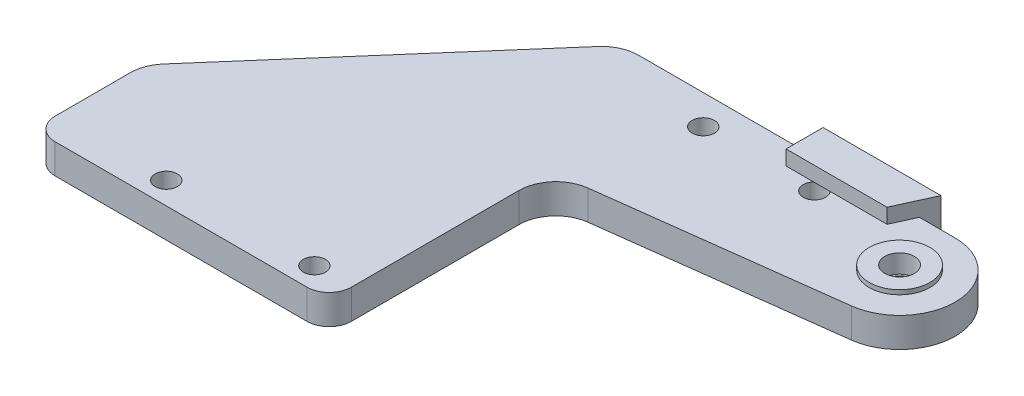
ISO-10303-21;
HEADER;
FILE_DESCRIPTION(('STEP AP214'),'2;1');
FILE_NAME('part.step','',(''),(''),'','','');
FILE_SCHEMA(('AUTOMOTIVE_DESIGN { 1 0 10303 214 1 1 1 1 }'));
ENDSEC;
DATA;
#1=APPLICATION_CONTEXT('core data for automotive mechanical design processes');
#2=APPLICATION_PROTOCOL_DEFINITION('international standard','automotive_design',2000,#1);
#3=PRODUCT_CONTEXT('',#1,'mechanical');
#4=PRODUCT('Part','Part','',(#3));
#5=PRODUCT_RELATED_PRODUCT_CATEGORY('part','',(#4));
#6=PRODUCT_DEFINITION_FORMATION('','',#4);
#7=PRODUCT_DEFINITION_CONTEXT('part definition',#1,'design');
#8=PRODUCT_DEFINITION('design','',#6,#7);
#9=PRODUCT_DEFINITION_SHAPE('','',#8);
#10=(LENGTH_UNIT() NAMED_UNIT(*) SI_UNIT(.MILLI.,.METRE.));
#11=(NAMED_UNIT(*) PLANE_ANGLE_UNIT() SI_UNIT($,.RADIAN.));
#12=(NAMED_UNIT(*) SI_UNIT($,.STERADIAN.) SOLID_ANGLE_UNIT());
#13=UNCERTAINTY_MEASURE_WITH_UNIT(LENGTH_MEASURE(1.E-05),#10,'distance_accuracy_value','');
#14=(GEOMETRIC_REPRESENTATION_CONTEXT(3) GLOBAL_UNCERTAINTY_ASSIGNED_CONTEXT((#13)) GLOBAL_UNIT_ASSIGNED_CONTEXT((#10,
#11,#12)) REPRESENTATION_CONTEXT('',''));
#15=CARTESIAN_POINT('',(0.,0.,0.));
#16=DIRECTION('',(0.,0.,1.));
#17=DIRECTION('',(1.,0.,0.));
#18=AXIS2_PLACEMENT_3D('',#15,#16,#17);
#19=CARTESIAN_POINT('',(68.8086591282946,6.,-46.5));
#20=DIRECTION('',(0.,0.,-1.));
#21=DIRECTION('',(-1.,0.,0.));
#22=AXIS2_PLACEMENT_3D('',#19,#20,#21);
#23=PLANE('',#22);
#24=DIRECTION('',(1.,0.,0.));
#25=VECTOR('',#24,1.);
#26=CARTESIAN_POINT('',(68.8086591282946,4.,-46.5));
#27=LINE('',#26,#25);
#28=CARTESIAN_POINT('',(55.1758378948923,4.,-46.5));
#29=VERTEX_POINT('',#28);
#30=CARTESIAN_POINT('',(68.8086591282946,4.,-46.5));
#31=VERTEX_POINT('',#30);
#32=EDGE_CURVE('E155',#29,#31,#27,.T.);
#33=ORIENTED_EDGE('',*,*,#32,.T.);
#34=DIRECTION('',(0.,-1.,0.));
#35=VECTOR('',#34,1.);
#36=CARTESIAN_POINT('',(68.8086591282946,6.,-46.5));
#37=LINE('',#36,#35);
#38=CARTESIAN_POINT('',(68.8086591282946,6.,-46.5));
#39=VERTEX_POINT('',#38);
#40=EDGE_CURVE('E12',#39,#31,#37,.T.);
#41=ORIENTED_EDGE('',*,*,#40,.F.);
#42=DIRECTION('',(1.,0.,0.));
#43=VECTOR('',#42,1.);
#44=CARTESIAN_POINT('',(68.8086591282946,6.,-46.5));
#45=LINE('',#44,#43);
#46=CARTESIAN_POINT('',(55.1758378948923,6.,-46.5));
#47=VERTEX_POINT('',#46);
#48=EDGE_CURVE('E161',#47,#39,#45,.T.);
#49=ORIENTED_EDGE('',*,*,#48,.F.);
#50=DIRECTION('',(0.,-1.,0.));
#51=VECTOR('',#50,1.);
#52=CARTESIAN_POINT('',(55.1758378948923,6.,-46.5));
#53=LINE('',#52,#51);
#54=EDGE_CURVE('E167',#47,#29,#53,.T.);
#55=ORIENTED_EDGE('',*,*,#54,.T.);
#56=EDGE_LOOP('',(#33,#41,#49,#55));
#57=FACE_BOUND('',#56,.T.);
#58=ADVANCED_FACE('F52',(#57),#23,.F.);
#59=CARTESIAN_POINT('',(71.0872904059575,6.,-51.5));
#60=DIRECTION('',(-0.909961270876545,0.,-0.414693242656235));
#61=DIRECTION('',(-0.414693242656235,0.,0.909961270876545));
#62=AXIS2_PLACEMENT_3D('',#59,#60,#61);
#63=PLANE('',#62);
#64=DIRECTION('',(0.414693242656235,0.,-0.909961270876545));
#65=VECTOR('',#64,1.);
#66=CARTESIAN_POINT('',(71.0872904059575,4.,-51.5));
#67=LINE('',#66,#65);
#68=CARTESIAN_POINT('',(70.1758378948923,4.,-49.5));
#69=VERTEX_POINT('',#68);
#70=EDGE_CURVE('E170',#31,#69,#67,.T.);
#71=ORIENTED_EDGE('',*,*,#70,.T.);
#72=DIRECTION('',(0.,-1.,0.));
#73=VECTOR('',#72,1.);
#74=CARTESIAN_POINT('',(70.1758378948923,20.0366555432198,-49.5));
#75=LINE('',#74,#73);
#76=CARTESIAN_POINT('',(70.1758378948923,0.,-49.5));
#77=VERTEX_POINT('',#76);
#78=EDGE_CURVE('E131',#69,#77,#75,.T.);
#79=ORIENTED_EDGE('',*,*,#78,.T.);
#80=DIRECTION('',(0.414693242656235,0.,-0.909961270876545));
#81=VECTOR('',#80,1.);
#82=CARTESIAN_POINT('',(71.0872904059575,0.,-51.5));
#83=LINE('',#82,#81);
#84=CARTESIAN_POINT('',(68.8086591282946,0.,-46.5));
#85=VERTEX_POINT('',#84);
#86=EDGE_CURVE('E123',#85,#77,#83,.T.);
#87=ORIENTED_EDGE('',*,*,#86,.F.);
#88=DIRECTION('',(0.,-1.,0.));
#89=VECTOR('',#88,1.);
#90=CARTESIAN_POINT('',(68.8086591282946,0.,-46.5));
#91=LINE('',#90,#89);
#92=CARTESIAN_POINT('',(68.8086591282946,-2.,-46.5));
#93=VERTEX_POINT('',#92);
#94=EDGE_CURVE('E128',#85,#93,#91,.T.);
#95=ORIENTED_EDGE('',*,*,#94,.T.);
#96=DIRECTION('',(0.414693242656235,0.,-0.909961270876545));
#97=VECTOR('',#96,1.);
#98=CARTESIAN_POINT('',(71.0872904059575,-2.,-51.5));
#99=LINE('',#98,#97);
#100=CARTESIAN_POINT('',(71.0872904059575,-2.,-51.5));
#101=VERTEX_POINT('',#100);
#102=EDGE_CURVE('E183',#93,#101,#99,.T.);
#103=ORIENTED_EDGE('',*,*,#102,.T.);
#104=DIRECTION('',(0.,-1.,0.));
#105=VECTOR('',#104,1.);
#106=CARTESIAN_POINT('',(71.0872904059575,6.,-51.5));
#107=LINE('',#106,#105);
#108=CARTESIAN_POINT('',(71.0872904059575,6.,-51.5));
#109=VERTEX_POINT('',#108);
#110=EDGE_CURVE('E59',#109,#101,#107,.T.);
#111=ORIENTED_EDGE('',*,*,#110,.F.);
#112=DIRECTION('',(0.414693242656235,0.,-0.909961270876545));
#113=VECTOR('',#112,1.);
#114=CARTESIAN_POINT('',(71.0872904059575,6.,-51.5));
#115=LINE('',#114,#113);
#116=EDGE_CURVE('E95',#39,#109,#115,.T.);
#117=ORIENTED_EDGE('',*,*,#116,.F.);
#118=ORIENTED_EDGE('',*,*,#40,.T.);
#119=EDGE_LOOP('',(#71,#79,#87,#95,#103,#111,#117,#118));
#120=FACE_BOUND('',#119,.T.);
#121=ADVANCED_FACE('F125',(#120),#63,.F.);
#122=CARTESIAN_POINT('',(55.1758378948923,6.,-51.5));
#123=DIRECTION('',(0.,0.,1.));
#124=DIRECTION('',(1.,0.,0.));
#125=AXIS2_PLACEMENT_3D('',#122,#123,#124);
#126=PLANE('',#125);
#127=ORIENTED_EDGE('',*,*,#110,.T.);
#128=DIRECTION('',(-1.,0.,0.));
#129=VECTOR('',#128,1.);
#130=CARTESIAN_POINT('',(55.1758378948923,-2.,-51.5));
#131=LINE('',#130,#129);
#132=CARTESIAN_POINT('',(55.1758378948923,-2.,-51.5));
#133=VERTEX_POINT('',#132);
#134=EDGE_CURVE('E181',#101,#133,#131,.T.);
#135=ORIENTED_EDGE('',*,*,#134,.T.);
#136=DIRECTION('',(0.,-1.,0.));
#137=VECTOR('',#136,1.);
#138=CARTESIAN_POINT('',(55.1758378948923,6.,-51.5));
#139=LINE('',#138,#137);
#140=CARTESIAN_POINT('',(55.1758378948923,6.,-51.5));
#141=VERTEX_POINT('',#140);
#142=EDGE_CURVE('E174',#141,#133,#139,.T.);
#143=ORIENTED_EDGE('',*,*,#142,.F.);
#144=DIRECTION('',(-1.,0.,0.));
#145=VECTOR('',#144,1.);
#146=CARTESIAN_POINT('',(55.1758378948923,6.,-51.5));
#147=LINE('',#146,#145);
#148=EDGE_CURVE('E164',#109,#141,#147,.T.);
#149=ORIENTED_EDGE('',*,*,#148,.F.);
#150=EDGE_LOOP('',(#127,#135,#143,#149));
#151=FACE_BOUND('',#150,.T.);
#152=ADVANCED_FACE('F178',(#151),#126,.F.);
#153=CARTESIAN_POINT('',(55.1758378948923,6.,-46.5));
#154=DIRECTION('',(1.,0.,0.));
#155=DIRECTION('',(0.,0.,-1.));
#156=AXIS2_PLACEMENT_3D('',#153,#154,#155);
#157=PLANE('',#156);
#158=ORIENTED_EDGE('',*,*,#142,.T.);
#159=DIRECTION('',(0.,0.,1.));
#160=VECTOR('',#159,1.);
#161=CARTESIAN_POINT('',(55.1758378948923,-2.,-46.5));
#162=LINE('',#161,#160);
#163=CARTESIAN_POINT('',(55.1758378948923,-2.,-46.5));
#164=VERTEX_POINT('',#163);
#165=EDGE_CURVE('E143',#133,#164,#162,.T.);
#166=ORIENTED_EDGE('',*,*,#165,.T.);
#167=DIRECTION('',(0.,-1.,0.));
#168=VECTOR('',#167,1.);
#169=CARTESIAN_POINT('',(55.1758378948923,0.,-46.5));
#170=LINE('',#169,#168);
#171=CARTESIAN_POINT('',(55.1758378948923,0.,-46.5));
#172=VERTEX_POINT('',#171);
#173=EDGE_CURVE('E149',#172,#164,#170,.T.);
#174=ORIENTED_EDGE('',*,*,#173,.F.);
#175=DIRECTION('',(0.,0.,1.));
#176=VECTOR('',#175,1.);
#177=CARTESIAN_POINT('',(55.1758378948923,0.,-46.5));
#178=LINE('',#177,#176);
#179=CARTESIAN_POINT('',(55.1758378948923,0.,-49.5));
#180=VERTEX_POINT('',#179);
#181=EDGE_CURVE('E134',#180,#172,#178,.T.);
#182=ORIENTED_EDGE('',*,*,#181,.F.);
#183=DIRECTION('',(0.,-1.,0.));
#184=VECTOR('',#183,1.);
#185=CARTESIAN_POINT('',(55.1758378948923,20.0366555432198,-49.5));
#186=LINE('',#185,#184);
#187=CARTESIAN_POINT('',(55.1758378948923,4.,-49.5));
#188=VERTEX_POINT('',#187);
#189=EDGE_CURVE('E156',#188,#180,#186,.T.);
#190=ORIENTED_EDGE('',*,*,#189,.F.);
#191=DIRECTION('',(0.,0.,1.));
#192=VECTOR('',#191,1.);
#193=CARTESIAN_POINT('',(55.1758378948923,4.,-46.5));
#194=LINE('',#193,#192);
#195=EDGE_CURVE('E88',#188,#29,#194,.T.);
#196=ORIENTED_EDGE('',*,*,#195,.T.);
#197=ORIENTED_EDGE('',*,*,#54,.F.);
#198=DIRECTION('',(0.,0.,1.));
#199=VECTOR('',#198,1.);
#200=CARTESIAN_POINT('',(55.1758378948923,6.,-46.5));
#201=LINE('',#200,#199);
#202=EDGE_CURVE('E75',#141,#47,#201,.T.);
#203=ORIENTED_EDGE('',*,*,#202,.F.);
#204=EDGE_LOOP('',(#158,#166,#174,#182,#190,#196,#197,#203));
#205=FACE_BOUND('',#204,.T.);
#206=ADVANCED_FACE('F190',(#205),#157,.F.);
#207=CARTESIAN_POINT('',(0.,6.,0.));
#208=DIRECTION('',(0.,-1.,0.));
#209=DIRECTION('',(0.,0.,-1.));
#210=AXIS2_PLACEMENT_3D('',#207,#208,#209);
#211=PLANE('',#210);
#212=ORIENTED_EDGE('',*,*,#48,.T.);
#213=ORIENTED_EDGE('',*,*,#116,.T.);
#214=ORIENTED_EDGE('',*,*,#148,.T.);
#215=ORIENTED_EDGE('',*,*,#202,.T.);
#216=EDGE_LOOP('',(#212,#213,#214,#215));
#217=FACE_BOUND('',#216,.T.);
#218=ADVANCED_FACE('F195',(#217),#211,.F.);
#219=CARTESIAN_POINT('',(0.,4.,0.));
#220=DIRECTION('',(0.,-1.,0.));
#221=DIRECTION('',(0.,0.,-1.));
#222=AXIS2_PLACEMENT_3D('',#219,#220,#221);
#223=PLANE('',#222);
#224=DIRECTION('',(-1.,0.,0.));
#225=VECTOR('',#224,1.);
#226=CARTESIAN_POINT('',(55.1758378948923,4.,-49.5));
#227=LINE('',#226,#225);
#228=EDGE_CURVE('E66',#69,#188,#227,.T.);
#229=ORIENTED_EDGE('',*,*,#228,.F.);
#230=ORIENTED_EDGE('',*,*,#70,.F.);
#231=ORIENTED_EDGE('',*,*,#32,.F.);
#232=ORIENTED_EDGE('',*,*,#195,.F.);
#233=EDGE_LOOP('',(#229,#230,#231,#232));
#234=FACE_BOUND('',#233,.T.);
#235=ADVANCED_FACE('F197',(#234),#223,.T.);
#236=CARTESIAN_POINT('',(55.1758378948923,20.0366555432198,-49.5));
#237=DIRECTION('',(0.,0.,-1.));
#238=DIRECTION('',(-1.,0.,0.));
#239=AXIS2_PLACEMENT_3D('',#236,#237,#238);
#240=PLANE('',#239);
#241=ORIENTED_EDGE('',*,*,#78,.F.);
#242=ORIENTED_EDGE('',*,*,#228,.T.);
#243=ORIENTED_EDGE('',*,*,#189,.T.);
#244=DIRECTION('',(1.,0.,0.));
#245=VECTOR('',#244,1.);
#246=CARTESIAN_POINT('',(55.1758378948923,0.,-49.5));
#247=LINE('',#246,#245);
#248=EDGE_CURVE('E148',#180,#77,#247,.T.);
#249=ORIENTED_EDGE('',*,*,#248,.T.);
#250=EDGE_LOOP('',(#241,#242,#243,#249));
#251=FACE_BOUND('',#250,.T.);
#252=ADVANCED_FACE('F203',(#251),#240,.F.);
#253=CARTESIAN_POINT('',(68.8086591282946,0.,-46.5));
#254=DIRECTION('',(0.,0.,-1.));
#255=DIRECTION('',(-1.,0.,0.));
#256=AXIS2_PLACEMENT_3D('',#253,#254,#255);
#257=PLANE('',#256);
#258=DIRECTION('',(1.,0.,0.));
#259=VECTOR('',#258,1.);
#260=CARTESIAN_POINT('',(68.8086591282946,-2.,-46.5));
#261=LINE('',#260,#259);
#262=EDGE_CURVE('E147',#164,#93,#261,.T.);
#263=ORIENTED_EDGE('',*,*,#262,.T.);
#264=ORIENTED_EDGE('',*,*,#94,.F.);
#265=DIRECTION('',(1.,0.,0.));
#266=VECTOR('',#265,1.);
#267=CARTESIAN_POINT('',(68.8086591282946,0.,-46.5));
#268=LINE('',#267,#266);
#269=EDGE_CURVE('E135',#172,#85,#268,.T.);
#270=ORIENTED_EDGE('',*,*,#269,.F.);
#271=ORIENTED_EDGE('',*,*,#173,.T.);
#272=EDGE_LOOP('',(#263,#264,#270,#271));
#273=FACE_BOUND('',#272,.T.);
#274=ADVANCED_FACE('F145',(#273),#257,.F.);
#275=CARTESIAN_POINT('',(0.,0.,0.));
#276=DIRECTION('',(0.,-1.,0.));
#277=DIRECTION('',(0.,0.,-1.));
#278=AXIS2_PLACEMENT_3D('',#275,#276,#277);
#279=PLANE('',#278);
#280=ORIENTED_EDGE('',*,*,#248,.F.);
#281=ORIENTED_EDGE('',*,*,#181,.T.);
#282=ORIENTED_EDGE('',*,*,#269,.T.);
#283=ORIENTED_EDGE('',*,*,#86,.T.);
#284=EDGE_LOOP('',(#280,#281,#282,#283));
#285=FACE_BOUND('',#284,.T.);
#286=ADVANCED_FACE('F138',(#285),#279,.F.);
#287=CARTESIAN_POINT('',(0.,-2.,0.));
#288=DIRECTION('',(0.,-1.,0.));
#289=DIRECTION('',(0.,0.,-1.));
#290=AXIS2_PLACEMENT_3D('',#287,#288,#289);
#291=PLANE('',#290);
#292=ORIENTED_EDGE('',*,*,#262,.F.);
#293=ORIENTED_EDGE('',*,*,#165,.F.);
#294=ORIENTED_EDGE('',*,*,#134,.F.);
#295=ORIENTED_EDGE('',*,*,#102,.F.);
#296=EDGE_LOOP('',(#292,#293,#294,#295));
#297=FACE_BOUND('',#296,.T.);
#298=ADVANCED_FACE('F186',(#297),#291,.T.);
#299=CLOSED_SHELL('',(#58,#121,#152,#206,#218,#235,#252,#274,#286,#298));
#300=MANIFOLD_SOLID_BREP('B2',#299);
#301=CARTESIAN_POINT('',(75.,0.,-42.));
#302=DIRECTION('',(0.,-1.,0.));
#303=DIRECTION('',(0.,0.,-1.));
#304=AXIS2_PLACEMENT_3D('',#301,#302,#303);
#305=CYLINDRICAL_SURFACE('',#304,3.5);
#306=CARTESIAN_POINT('',(75.,4.,-42.));
#307=DIRECTION('',(0.,-1.,0.));
#308=DIRECTION('',(0.,0.,-1.));
#309=AXIS2_PLACEMENT_3D('',#306,#307,#308);
#310=CIRCLE('',#309,3.5);
#311=CARTESIAN_POINT('',(75.,4.,-45.5));
#312=VERTEX_POINT('',#311);
#313=EDGE_CURVE('E375',#312,#312,#310,.T.);
#314=ORIENTED_EDGE('',*,*,#313,.T.);
#315=EDGE_LOOP('',(#314));
#316=FACE_BOUND('',#315,.T.);
#317=CARTESIAN_POINT('',(75.,2.1,-42.));
#318=DIRECTION('',(0.,-1.,0.));
#319=DIRECTION('',(0.,0.,-1.));
#320=AXIS2_PLACEMENT_3D('',#317,#318,#319);
#321=CIRCLE('',#320,3.5);
#322=CARTESIAN_POINT('',(75.,2.1,-45.5));
#323=VERTEX_POINT('',#322);
#324=EDGE_CURVE('E51',#323,#323,#321,.T.);
#325=ORIENTED_EDGE('',*,*,#324,.F.);
#326=EDGE_LOOP('',(#325));
#327=FACE_BOUND('',#326,.T.);
#328=ADVANCED_FACE('F353',(#316,#327),#305,.T.);
#329=CARTESIAN_POINT('',(75.,2.1,-38.5));
#330=DIRECTION('',(0.,-1.,0.));
#331=DIRECTION('',(0.,0.,-1.));
#332=AXIS2_PLACEMENT_3D('',#329,#330,#331);
#333=PLANE('',#332);
#334=ORIENTED_EDGE('',*,*,#324,.T.);
#335=EDGE_LOOP('',(#334));
#336=FACE_BOUND('',#335,.T.);
#337=CARTESIAN_POINT('',(75.,2.1,-42.));
#338=DIRECTION('',(0.,-1.,0.));
#339=DIRECTION('',(0.,0.,-1.));
#340=AXIS2_PLACEMENT_3D('',#337,#338,#339);
#341=CIRCLE('',#340,2.);
#342=CARTESIAN_POINT('',(75.,2.1,-44.));
#343=VERTEX_POINT('',#342);
#344=EDGE_CURVE('E359',#343,#343,#341,.T.);
#345=ORIENTED_EDGE('',*,*,#344,.F.);
#346=EDGE_LOOP('',(#345));
#347=FACE_BOUND('',#346,.T.);
#348=ADVANCED_FACE('F393',(#336,#347),#333,.T.);
#349=CARTESIAN_POINT('',(75.,0.,-42.));
#350=DIRECTION('',(0.,-1.,0.));
#351=DIRECTION('',(0.,0.,-1.));
#352=AXIS2_PLACEMENT_3D('',#349,#350,#351);
#353=CYLINDRICAL_SURFACE('',#352,2.);
#354=ORIENTED_EDGE('',*,*,#344,.T.);
#355=EDGE_LOOP('',(#354));
#356=FACE_BOUND('',#355,.T.);
#357=CARTESIAN_POINT('',(75.,4.6,-42.));
#358=DIRECTION('',(0.,-1.,0.));
#359=DIRECTION('',(0.,0.,-1.));
#360=AXIS2_PLACEMENT_3D('',#357,#358,#359);
#361=CIRCLE('',#360,2.);
#362=CARTESIAN_POINT('',(75.,4.6,-44.));
#363=VERTEX_POINT('',#362);
#364=EDGE_CURVE('E363',#363,#363,#361,.T.);
#365=ORIENTED_EDGE('',*,*,#364,.F.);
#366=EDGE_LOOP('',(#365));
#367=FACE_BOUND('',#366,.T.);
#368=ADVANCED_FACE('F397',(#356,#367),#353,.F.);
#369=CARTESIAN_POINT('',(75.,4.6,-37.9));
#370=DIRECTION('',(0.,1.,0.));
#371=DIRECTION('',(0.,0.,1.));
#372=AXIS2_PLACEMENT_3D('',#369,#370,#371);
#373=PLANE('',#372);
#374=ORIENTED_EDGE('',*,*,#364,.T.);
#375=EDGE_LOOP('',(#374));
#376=FACE_BOUND('',#375,.T.);
#377=CARTESIAN_POINT('',(75.,4.6,-42.));
#378=DIRECTION('',(0.,-1.,0.));
#379=DIRECTION('',(0.,0.,-1.));
#380=AXIS2_PLACEMENT_3D('',#377,#378,#379);
#381=CIRCLE('',#380,4.1);
#382=CARTESIAN_POINT('',(75.,4.6,-46.1));
#383=VERTEX_POINT('',#382);
#384=EDGE_CURVE('E367',#383,#383,#381,.T.);
#385=ORIENTED_EDGE('',*,*,#384,.F.);
#386=EDGE_LOOP('',(#385));
#387=FACE_BOUND('',#386,.T.);
#388=ADVANCED_FACE('F389',(#376,#387),#373,.T.);
#389=CARTESIAN_POINT('',(75.,0.,-42.));
#390=DIRECTION('',(0.,-1.,0.));
#391=DIRECTION('',(0.,0.,-1.));
#392=AXIS2_PLACEMENT_3D('',#389,#390,#391);
#393=CYLINDRICAL_SURFACE('',#392,4.1);
#394=ORIENTED_EDGE('',*,*,#384,.T.);
#395=EDGE_LOOP('',(#394));
#396=FACE_BOUND('',#395,.T.);
#397=CARTESIAN_POINT('',(75.,4.,-42.));
#398=DIRECTION('',(0.,-1.,0.));
#399=DIRECTION('',(0.,0.,-1.));
#400=AXIS2_PLACEMENT_3D('',#397,#398,#399);
#401=CIRCLE('',#400,4.1);
#402=CARTESIAN_POINT('',(75.,4.,-46.1));
#403=VERTEX_POINT('',#402);
#404=EDGE_CURVE('E372',#403,#403,#401,.T.);
#405=ORIENTED_EDGE('',*,*,#404,.F.);
#406=EDGE_LOOP('',(#405));
#407=FACE_BOUND('',#406,.T.);
#408=ADVANCED_FACE('F383',(#396,#407),#393,.T.);
#409=CARTESIAN_POINT('',(75.,4.,-38.5));
#410=DIRECTION('',(0.,-1.,0.));
#411=DIRECTION('',(0.,0.,-1.));
#412=AXIS2_PLACEMENT_3D('',#409,#410,#411);
#413=PLANE('',#412);
#414=ORIENTED_EDGE('',*,*,#404,.T.);
#415=EDGE_LOOP('',(#414));
#416=FACE_BOUND('',#415,.T.);
#417=ORIENTED_EDGE('',*,*,#313,.F.);
#418=EDGE_LOOP('',(#417));
#419=FACE_BOUND('',#418,.T.);
#420=ADVANCED_FACE('F381',(#416,#419),#413,.T.);
#421=CLOSED_SHELL('',(#328,#348,#368,#388,#408,#420));
#422=MANIFOLD_SOLID_BREP('B6',#421);
#423=CARTESIAN_POINT('',(75.,0.,-38.5));
#424=DIRECTION('',(0.,1.,0.));
#425=DIRECTION('',(0.,0.,1.));
#426=AXIS2_PLACEMENT_3D('',#423,#424,#425);
#427=PLANE('',#426);
#428=CARTESIAN_POINT('',(75.,0.,-42.));
#429=DIRECTION('',(0.,-1.,0.));
#430=DIRECTION('',(0.,0.,-1.));
#431=AXIS2_PLACEMENT_3D('',#428,#429,#430);
#432=CIRCLE('',#431,3.5);
#433=CARTESIAN_POINT('',(75.,0.,-45.5));
#434=VERTEX_POINT('',#433);
#435=EDGE_CURVE('E489',#434,#434,#432,.T.);
#436=ORIENTED_EDGE('',*,*,#435,.T.);
#437=EDGE_LOOP('',(#436));
#438=FACE_BOUND('',#437,.T.);
#439=CARTESIAN_POINT('',(75.,0.,-42.));
#440=DIRECTION('',(0.,-1.,0.));
#441=DIRECTION('',(0.,0.,-1.));
#442=AXIS2_PLACEMENT_3D('',#439,#440,#441);
#443=CIRCLE('',#442,4.1);
#444=CARTESIAN_POINT('',(75.,0.,-46.1));
#445=VERTEX_POINT('',#444);
#446=EDGE_CURVE('E352',#445,#445,#443,.T.);
#447=ORIENTED_EDGE('',*,*,#446,.F.);
#448=EDGE_LOOP('',(#447));
#449=FACE_BOUND('',#448,.T.);
#450=ADVANCED_FACE('F467',(#438,#449),#427,.T.);
#451=CARTESIAN_POINT('',(75.,0.,-42.));
#452=DIRECTION('',(0.,-1.,0.));
#453=DIRECTION('',(0.,0.,-1.));
#454=AXIS2_PLACEMENT_3D('',#451,#452,#453);
#455=CYLINDRICAL_SURFACE('',#454,4.1);
#456=ORIENTED_EDGE('',*,*,#446,.T.);
#457=EDGE_LOOP('',(#456));
#458=FACE_BOUND('',#457,.T.);
#459=CARTESIAN_POINT('',(75.,-0.6,-42.));
#460=DIRECTION('',(0.,-1.,0.));
#461=DIRECTION('',(0.,0.,-1.));
#462=AXIS2_PLACEMENT_3D('',#459,#460,#461);
#463=CIRCLE('',#462,4.1);
#464=CARTESIAN_POINT('',(75.,-0.6,-46.1));
#465=VERTEX_POINT('',#464);
#466=EDGE_CURVE('E473',#465,#465,#463,.T.);
#467=ORIENTED_EDGE('',*,*,#466,.F.);
#468=EDGE_LOOP('',(#467));
#469=FACE_BOUND('',#468,.T.);
#470=ADVANCED_FACE('F507',(#458,#469),#455,.T.);
#471=CARTESIAN_POINT('',(75.,-0.6,-37.9));
#472=DIRECTION('',(0.,-1.,0.));
#473=DIRECTION('',(0.,0.,-1.));
#474=AXIS2_PLACEMENT_3D('',#471,#472,#473);
#475=PLANE('',#474);
#476=ORIENTED_EDGE('',*,*,#466,.T.);
#477=EDGE_LOOP('',(#476));
#478=FACE_BOUND('',#477,.T.);
#479=CARTESIAN_POINT('',(75.,-0.6,-42.));
#480=DIRECTION('',(0.,-1.,0.));
#481=DIRECTION('',(0.,0.,-1.));
#482=AXIS2_PLACEMENT_3D('',#479,#480,#481);
#483=CIRCLE('',#482,2.);
#484=CARTESIAN_POINT('',(75.,-0.6,-44.));
#485=VERTEX_POINT('',#484);
#486=EDGE_CURVE('E477',#485,#485,#483,.T.);
#487=ORIENTED_EDGE('',*,*,#486,.F.);
#488=EDGE_LOOP('',(#487));
#489=FACE_BOUND('',#488,.T.);
#490=ADVANCED_FACE('F511',(#478,#489),#475,.T.);
#491=CARTESIAN_POINT('',(75.,0.,-42.));
#492=DIRECTION('',(0.,-1.,0.));
#493=DIRECTION('',(0.,0.,-1.));
#494=AXIS2_PLACEMENT_3D('',#491,#492,#493);
#495=CYLINDRICAL_SURFACE('',#494,2.);
#496=ORIENTED_EDGE('',*,*,#486,.T.);
#497=EDGE_LOOP('',(#496));
#498=FACE_BOUND('',#497,.T.);
#499=CARTESIAN_POINT('',(75.,1.9,-42.));
#500=DIRECTION('',(0.,-1.,0.));
#501=DIRECTION('',(0.,0.,-1.));
#502=AXIS2_PLACEMENT_3D('',#499,#500,#501);
#503=CIRCLE('',#502,2.);
#504=CARTESIAN_POINT('',(75.,1.9,-44.));
#505=VERTEX_POINT('',#504);
#506=EDGE_CURVE('E481',#505,#505,#503,.T.);
#507=ORIENTED_EDGE('',*,*,#506,.F.);
#508=EDGE_LOOP('',(#507));
#509=FACE_BOUND('',#508,.T.);
#510=ADVANCED_FACE('F503',(#498,#509),#495,.F.);
#511=CARTESIAN_POINT('',(75.,1.9,-38.5));
#512=DIRECTION('',(0.,1.,0.));
#513=DIRECTION('',(0.,0.,1.));
#514=AXIS2_PLACEMENT_3D('',#511,#512,#513);
#515=PLANE('',#514);
#516=ORIENTED_EDGE('',*,*,#506,.T.);
#517=EDGE_LOOP('',(#516));
#518=FACE_BOUND('',#517,.T.);
#519=CARTESIAN_POINT('',(75.,1.9,-42.));
#520=DIRECTION('',(0.,-1.,0.));
#521=DIRECTION('',(0.,0.,-1.));
#522=AXIS2_PLACEMENT_3D('',#519,#520,#521);
#523=CIRCLE('',#522,3.5);
#524=CARTESIAN_POINT('',(75.,1.9,-45.5));
#525=VERTEX_POINT('',#524);
#526=EDGE_CURVE('E486',#525,#525,#523,.T.);
#527=ORIENTED_EDGE('',*,*,#526,.F.);
#528=EDGE_LOOP('',(#527));
#529=FACE_BOUND('',#528,.T.);
#530=ADVANCED_FACE('F497',(#518,#529),#515,.T.);
#531=CARTESIAN_POINT('',(75.,0.,-42.));
#532=DIRECTION('',(0.,-1.,0.));
#533=DIRECTION('',(0.,0.,-1.));
#534=AXIS2_PLACEMENT_3D('',#531,#532,#533);
#535=CYLINDRICAL_SURFACE('',#534,3.5);
#536=ORIENTED_EDGE('',*,*,#526,.T.);
#537=EDGE_LOOP('',(#536));
#538=FACE_BOUND('',#537,.T.);
#539=ORIENTED_EDGE('',*,*,#435,.F.);
#540=EDGE_LOOP('',(#539));
#541=FACE_BOUND('',#540,.T.);
#542=ADVANCED_FACE('F495',(#538,#541),#535,.T.);
#543=CLOSED_SHELL('',(#450,#470,#490,#510,#530,#542));
#544=MANIFOLD_SOLID_BREP('B46',#543);
#545=CARTESIAN_POINT('',(75.,4.,-42.));
#546=DIRECTION('',(0.,1.,0.));
#547=DIRECTION('',(0.,0.,1.));
#548=AXIS2_PLACEMENT_3D('',#545,#546,#547);
#549=PLANE('',#548);
#550=CARTESIAN_POINT('',(45.,4.,-45.5));
#551=DIRECTION('',(0.,1.,0.));
#552=DIRECTION('',(0.,0.,1.));
#553=AXIS2_PLACEMENT_3D('',#550,#551,#552);
#554=CIRCLE('',#553,1.5);
#555=CARTESIAN_POINT('',(45.,4.,-44.));
#556=VERTEX_POINT('',#555);
#557=EDGE_CURVE('E849',#556,#556,#554,.T.);
#558=ORIENTED_EDGE('',*,*,#557,.F.);
#559=EDGE_LOOP('',(#558));
#560=FACE_BOUND('',#559,.T.);
#561=CARTESIAN_POINT('',(15.,4.,-3.));
#562=DIRECTION('',(0.,1.,0.));
#563=DIRECTION('',(0.,0.,1.));
#564=AXIS2_PLACEMENT_3D('',#561,#562,#563);
#565=CIRCLE('',#564,1.5);
#566=CARTESIAN_POINT('',(15.,4.,-1.5));
#567=VERTEX_POINT('',#566);
#568=EDGE_CURVE('E837',#567,#567,#565,.T.);
#569=ORIENTED_EDGE('',*,*,#568,.F.);
#570=EDGE_LOOP('',(#569));
#571=FACE_BOUND('',#570,.T.);
#572=DIRECTION('',(0.,0.,1.));
#573=VECTOR('',#572,1.);
#574=CARTESIAN_POINT('',(0.,4.,0.));
#575=LINE('',#574,#573);
#576=CARTESIAN_POINT('',(0.,4.,-13.1301246729359));
#577=VERTEX_POINT('',#576);
#578=CARTESIAN_POINT('',(0.,4.,-3.));
#579=VERTEX_POINT('',#578);
#580=EDGE_CURVE('E712',#577,#579,#575,.T.);
#581=ORIENTED_EDGE('',*,*,#580,.T.);
#582=CARTESIAN_POINT('',(3.,4.,-3.));
#583=DIRECTION('',(0.,1.,0.));
#584=DIRECTION('',(0.,0.,1.));
#585=AXIS2_PLACEMENT_3D('',#582,#583,#584);
#586=CIRCLE('',#585,3.);
#587=CARTESIAN_POINT('',(3.,4.,0.));
#588=VERTEX_POINT('',#587);
#589=EDGE_CURVE('E736',#579,#588,#586,.T.);
#590=ORIENTED_EDGE('',*,*,#589,.T.);
#591=DIRECTION('',(1.,0.,0.));
#592=VECTOR('',#591,1.);
#593=CARTESIAN_POINT('',(0.,4.,0.));
#594=LINE('',#593,#592);
#595=CARTESIAN_POINT('',(37.,4.,0.));
#596=VERTEX_POINT('',#595);
#597=EDGE_CURVE('E821',#588,#596,#594,.T.);
#598=ORIENTED_EDGE('',*,*,#597,.T.);
#599=CARTESIAN_POINT('',(37.,4.,-3.));
#600=DIRECTION('',(0.,1.,0.));
#601=DIRECTION('',(0.,0.,1.));
#602=AXIS2_PLACEMENT_3D('',#599,#600,#601);
#603=CIRCLE('',#602,3.);
#604=CARTESIAN_POINT('',(40.,4.,-3.));
#605=VERTEX_POINT('',#604);
#606=EDGE_CURVE('E734',#596,#605,#603,.T.);
#607=ORIENTED_EDGE('',*,*,#606,.T.);
#608=DIRECTION('',(0.,0.,-1.));
#609=VECTOR('',#608,1.);
#610=CARTESIAN_POINT('',(40.,4.,0.));
#611=LINE('',#610,#609);
#612=CARTESIAN_POINT('',(40.,4.,-25.5942014492755));
#613=VERTEX_POINT('',#612);
#614=EDGE_CURVE('E672',#605,#613,#611,.T.);
#615=ORIENTED_EDGE('',*,*,#614,.T.);
#616=CARTESIAN_POINT('',(45.,4.,-25.5942014492755));
#617=DIRECTION('',(0.,1.,0.));
#618=DIRECTION('',(0.,0.,1.));
#619=AXIS2_PLACEMENT_3D('',#616,#617,#618);
#620=CIRCLE('',#619,5.);
#621=CARTESIAN_POINT('',(44.3707717153111,4.,-30.5544506129514));
#622=VERTEX_POINT('',#621);
#623=EDGE_CURVE('E465',#613,#622,#620,.F.);
#624=ORIENTED_EDGE('',*,*,#623,.T.);
#625=DIRECTION('',(0.99204983273518,0.,-0.125845656937776));
#626=VECTOR('',#625,1.);
#627=CARTESIAN_POINT('',(40.,4.,-30.));
#628=LINE('',#627,#626);
#629=CARTESIAN_POINT('',(75.9438424270333,4.,-34.5596262544861));
#630=VERTEX_POINT('',#629);
#631=EDGE_CURVE('E660',#622,#630,#628,.T.);
#632=ORIENTED_EDGE('',*,*,#631,.T.);
#633=CARTESIAN_POINT('',(75.,4.,-42.));
#634=DIRECTION('',(0.,1.,0.));
#635=DIRECTION('',(0.,0.,1.));
#636=AXIS2_PLACEMENT_3D('',#633,#634,#635);
#637=CIRCLE('',#636,7.50000000000001);
#638=CARTESIAN_POINT('',(75.,4.,-49.5));
#639=VERTEX_POINT('',#638);
#640=EDGE_CURVE('E665',#630,#639,#637,.T.);
#641=ORIENTED_EDGE('',*,*,#640,.T.);
#642=DIRECTION('',(-1.,0.,0.));
#643=VECTOR('',#642,1.);
#644=CARTESIAN_POINT('',(30.,4.,-49.5));
#645=LINE('',#644,#643);
#646=CARTESIAN_POINT('',(32.2781524583166,4.,-49.5));
#647=VERTEX_POINT('',#646);
#648=EDGE_CURVE('E687',#639,#647,#645,.T.);
#649=ORIENTED_EDGE('',*,*,#648,.T.);
#650=CARTESIAN_POINT('',(32.2781524583166,4.,-44.5));
#651=DIRECTION('',(0.,1.,0.));
#652=DIRECTION('',(0.,0.,1.));
#653=AXIS2_PLACEMENT_3D('',#650,#651,#652);
#654=CIRCLE('',#653,5.);
#655=CARTESIAN_POINT('',(28.5051248474991,4.,-47.7808935746239));
#656=VERTEX_POINT('',#655);
#657=EDGE_CURVE('E594',#647,#656,#654,.T.);
#658=ORIENTED_EDGE('',*,*,#657,.T.);
#659=DIRECTION('',(-0.656178714924787,0.,0.754605522163505));
#660=VECTOR('',#659,1.);
#661=CARTESIAN_POINT('',(0.,4.,-15.));
#662=LINE('',#661,#660);
#663=CARTESIAN_POINT('',(1.22697238918248,4.,-16.4110182475598));
#664=VERTEX_POINT('',#663);
#665=EDGE_CURVE('E689',#656,#664,#662,.T.);
#666=ORIENTED_EDGE('',*,*,#665,.T.);
#667=CARTESIAN_POINT('',(5.,4.,-13.1301246729359));
#668=DIRECTION('',(0.,1.,0.));
#669=DIRECTION('',(0.,0.,1.));
#670=AXIS2_PLACEMENT_3D('',#667,#668,#669);
#671=CIRCLE('',#670,5.);
#672=EDGE_CURVE('E732',#664,#577,#671,.T.);
#673=ORIENTED_EDGE('',*,*,#672,.T.);
#674=EDGE_LOOP('',(#581,#590,#598,#607,#615,#624,#632,#641,#649,#658,#666,#673));
#675=FACE_BOUND('',#674,.T.);
#676=CARTESIAN_POINT('',(75.,4.,-42.));
#677=DIRECTION('',(0.,1.,0.));
#678=DIRECTION('',(0.,0.,1.));
#679=AXIS2_PLACEMENT_3D('',#676,#677,#678);
#680=CIRCLE('',#679,3.50000000000001);
#681=CARTESIAN_POINT('',(75.,4.,-38.5));
#682=VERTEX_POINT('',#681);
#683=EDGE_CURVE('E698',#682,#682,#680,.T.);
#684=ORIENTED_EDGE('',*,*,#683,.F.);
#685=EDGE_LOOP('',(#684));
#686=FACE_BOUND('',#685,.T.);
#687=CARTESIAN_POINT('',(35.,4.,-3.));
#688=DIRECTION('',(0.,1.,0.));
#689=DIRECTION('',(0.,0.,1.));
#690=AXIS2_PLACEMENT_3D('',#687,#688,#689);
#691=CIRCLE('',#690,1.5);
#692=CARTESIAN_POINT('',(35.,4.,-1.5));
#693=VERTEX_POINT('',#692);
#694=EDGE_CURVE('E843',#693,#693,#691,.T.);
#695=ORIENTED_EDGE('',*,*,#694,.F.);
#696=EDGE_LOOP('',(#695));
#697=FACE_BOUND('',#696,.T.);
#698=CARTESIAN_POINT('',(60.,4.,-45.5));
#699=DIRECTION('',(0.,1.,0.));
#700=DIRECTION('',(0.,0.,1.));
#701=AXIS2_PLACEMENT_3D('',#698,#699,#700);
#702=CIRCLE('',#701,1.5);
#703=CARTESIAN_POINT('',(60.,4.,-44.));
#704=VERTEX_POINT('',#703);
#705=EDGE_CURVE('E855',#704,#704,#702,.T.);
#706=ORIENTED_EDGE('',*,*,#705,.F.);
#707=EDGE_LOOP('',(#706));
#708=FACE_BOUND('',#707,.T.);
#709=ADVANCED_FACE('F572',(#560,#571,#675,#686,#697,#708),#549,.T.);
#710=CARTESIAN_POINT('',(75.,0.,-42.));
#711=DIRECTION('',(0.,1.,0.));
#712=DIRECTION('',(0.,0.,1.));
#713=AXIS2_PLACEMENT_3D('',#710,#711,#712);
#714=PLANE('',#713);
#715=DIRECTION('',(1.,0.,0.));
#716=VECTOR('',#715,1.);
#717=CARTESIAN_POINT('',(0.,0.,0.));
#718=LINE('',#717,#716);
#719=CARTESIAN_POINT('',(3.,0.,0.));
#720=VERTEX_POINT('',#719);
#721=CARTESIAN_POINT('',(37.,0.,0.));
#722=VERTEX_POINT('',#721);
#723=EDGE_CURVE('E697',#720,#722,#718,.T.);
#724=ORIENTED_EDGE('',*,*,#723,.F.);
#725=CARTESIAN_POINT('',(3.,0.,-3.));
#726=DIRECTION('',(0.,1.,0.));
#727=DIRECTION('',(0.,0.,1.));
#728=AXIS2_PLACEMENT_3D('',#725,#726,#727);
#729=CIRCLE('',#728,3.);
#730=CARTESIAN_POINT('',(0.,0.,-3.));
#731=VERTEX_POINT('',#730);
#732=EDGE_CURVE('E724',#720,#731,#729,.F.);
#733=ORIENTED_EDGE('',*,*,#732,.T.);
#734=DIRECTION('',(0.,0.,1.));
#735=VECTOR('',#734,1.);
#736=CARTESIAN_POINT('',(0.,0.,0.));
#737=LINE('',#736,#735);
#738=CARTESIAN_POINT('',(0.,0.,-13.1301246729359));
#739=VERTEX_POINT('',#738);
#740=EDGE_CURVE('E694',#739,#731,#737,.T.);
#741=ORIENTED_EDGE('',*,*,#740,.F.);
#742=CARTESIAN_POINT('',(5.,0.,-13.1301246729359));
#743=DIRECTION('',(0.,1.,0.));
#744=DIRECTION('',(0.,0.,1.));
#745=AXIS2_PLACEMENT_3D('',#742,#743,#744);
#746=CIRCLE('',#745,5.);
#747=CARTESIAN_POINT('',(1.22697238918248,0.,-16.4110182475598));
#748=VERTEX_POINT('',#747);
#749=EDGE_CURVE('E720',#739,#748,#746,.F.);
#750=ORIENTED_EDGE('',*,*,#749,.T.);
#751=DIRECTION('',(-0.656178714924787,0.,0.754605522163505));
#752=VECTOR('',#751,1.);
#753=CARTESIAN_POINT('',(0.,0.,-15.));
#754=LINE('',#753,#752);
#755=CARTESIAN_POINT('',(28.5051248474991,0.,-47.7808935746239));
#756=VERTEX_POINT('',#755);
#757=EDGE_CURVE('E710',#756,#748,#754,.T.);
#758=ORIENTED_EDGE('',*,*,#757,.F.);
#759=CARTESIAN_POINT('',(32.2781524583166,0.,-44.5));
#760=DIRECTION('',(0.,1.,0.));
#761=DIRECTION('',(0.,0.,1.));
#762=AXIS2_PLACEMENT_3D('',#759,#760,#761);
#763=CIRCLE('',#762,5.);
#764=CARTESIAN_POINT('',(32.2781524583166,0.,-49.5));
#765=VERTEX_POINT('',#764);
#766=EDGE_CURVE('E718',#756,#765,#763,.F.);
#767=ORIENTED_EDGE('',*,*,#766,.T.);
#768=DIRECTION('',(-1.,0.,0.));
#769=VECTOR('',#768,1.);
#770=CARTESIAN_POINT('',(30.,0.,-49.5));
#771=LINE('',#770,#769);
#772=CARTESIAN_POINT('',(75.,0.,-49.5));
#773=VERTEX_POINT('',#772);
#774=EDGE_CURVE('E707',#773,#765,#771,.T.);
#775=ORIENTED_EDGE('',*,*,#774,.F.);
#776=CARTESIAN_POINT('',(75.,0.,-42.));
#777=DIRECTION('',(0.,1.,0.));
#778=DIRECTION('',(0.,0.,1.));
#779=AXIS2_PLACEMENT_3D('',#776,#777,#778);
#780=CIRCLE('',#779,7.50000000000001);
#781=CARTESIAN_POINT('',(75.9438424270333,0.,-34.5596262544861));
#782=VERTEX_POINT('',#781);
#783=EDGE_CURVE('E705',#782,#773,#780,.T.);
#784=ORIENTED_EDGE('',*,*,#783,.F.);
#785=DIRECTION('',(0.99204983273518,0.,-0.125845656937776));
#786=VECTOR('',#785,1.);
#787=CARTESIAN_POINT('',(40.,0.,-30.));
#788=LINE('',#787,#786);
#789=CARTESIAN_POINT('',(44.3707717153111,0.,-30.5544506129514));
#790=VERTEX_POINT('',#789);
#791=EDGE_CURVE('E678',#790,#782,#788,.T.);
#792=ORIENTED_EDGE('',*,*,#791,.F.);
#793=CARTESIAN_POINT('',(45.,0.,-25.5942014492755));
#794=DIRECTION('',(0.,1.,0.));
#795=DIRECTION('',(0.,0.,1.));
#796=AXIS2_PLACEMENT_3D('',#793,#794,#795);
#797=CIRCLE('',#796,5.);
#798=CARTESIAN_POINT('',(40.,0.,-25.5942014492755));
#799=VERTEX_POINT('',#798);
#800=EDGE_CURVE('E580',#790,#799,#797,.T.);
#801=ORIENTED_EDGE('',*,*,#800,.T.);
#802=DIRECTION('',(0.,0.,-1.));
#803=VECTOR('',#802,1.);
#804=CARTESIAN_POINT('',(40.,0.,0.));
#805=LINE('',#804,#803);
#806=CARTESIAN_POINT('',(40.,0.,-3.));
#807=VERTEX_POINT('',#806);
#808=EDGE_CURVE('E701',#807,#799,#805,.T.);
#809=ORIENTED_EDGE('',*,*,#808,.F.);
#810=CARTESIAN_POINT('',(37.,0.,-3.));
#811=DIRECTION('',(0.,1.,0.));
#812=DIRECTION('',(0.,0.,1.));
#813=AXIS2_PLACEMENT_3D('',#810,#811,#812);
#814=CIRCLE('',#813,3.);
#815=EDGE_CURVE('E722',#807,#722,#814,.F.);
#816=ORIENTED_EDGE('',*,*,#815,.T.);
#817=EDGE_LOOP('',(#724,#733,#741,#750,#758,#767,#775,#784,#792,#801,#809,#816));
#818=FACE_BOUND('',#817,.T.);
#819=CARTESIAN_POINT('',(75.,0.,-42.));
#820=DIRECTION('',(0.,1.,0.));
#821=DIRECTION('',(0.,0.,1.));
#822=AXIS2_PLACEMENT_3D('',#819,#820,#821);
#823=CIRCLE('',#822,3.50000000000001);
#824=CARTESIAN_POINT('',(75.,0.,-38.5));
#825=VERTEX_POINT('',#824);
#826=EDGE_CURVE('E826',#825,#825,#823,.T.);
#827=ORIENTED_EDGE('',*,*,#826,.T.);
#828=EDGE_LOOP('',(#827));
#829=FACE_BOUND('',#828,.T.);
#830=CARTESIAN_POINT('',(15.,0.,-3.));
#831=DIRECTION('',(0.,1.,0.));
#832=DIRECTION('',(0.,0.,1.));
#833=AXIS2_PLACEMENT_3D('',#830,#831,#832);
#834=CIRCLE('',#833,1.5);
#835=CARTESIAN_POINT('',(15.,0.,-1.5));
#836=VERTEX_POINT('',#835);
#837=EDGE_CURVE('E840',#836,#836,#834,.T.);
#838=ORIENTED_EDGE('',*,*,#837,.T.);
#839=EDGE_LOOP('',(#838));
#840=FACE_BOUND('',#839,.T.);
#841=CARTESIAN_POINT('',(35.,0.,-3.));
#842=DIRECTION('',(0.,1.,0.));
#843=DIRECTION('',(0.,0.,1.));
#844=AXIS2_PLACEMENT_3D('',#841,#842,#843);
#845=CIRCLE('',#844,1.5);
#846=CARTESIAN_POINT('',(35.,0.,-1.5));
#847=VERTEX_POINT('',#846);
#848=EDGE_CURVE('E846',#847,#847,#845,.T.);
#849=ORIENTED_EDGE('',*,*,#848,.T.);
#850=EDGE_LOOP('',(#849));
#851=FACE_BOUND('',#850,.T.);
#852=CARTESIAN_POINT('',(45.,0.,-45.5));
#853=DIRECTION('',(0.,1.,0.));
#854=DIRECTION('',(0.,0.,1.));
#855=AXIS2_PLACEMENT_3D('',#852,#853,#854);
#856=CIRCLE('',#855,1.5);
#857=CARTESIAN_POINT('',(45.,0.,-44.));
#858=VERTEX_POINT('',#857);
#859=EDGE_CURVE('E852',#858,#858,#856,.T.);
#860=ORIENTED_EDGE('',*,*,#859,.T.);
#861=EDGE_LOOP('',(#860));
#862=FACE_BOUND('',#861,.T.);
#863=CARTESIAN_POINT('',(60.,0.,-45.5));
#864=DIRECTION('',(0.,1.,0.));
#865=DIRECTION('',(0.,0.,1.));
#866=AXIS2_PLACEMENT_3D('',#863,#864,#865);
#867=CIRCLE('',#866,1.5);
#868=CARTESIAN_POINT('',(60.,0.,-44.));
#869=VERTEX_POINT('',#868);
#870=EDGE_CURVE('E858',#869,#869,#867,.T.);
#871=ORIENTED_EDGE('',*,*,#870,.T.);
#872=EDGE_LOOP('',(#871));
#873=FACE_BOUND('',#872,.T.);
#874=ADVANCED_FACE('F753',(#818,#829,#840,#851,#862,#873),#714,.F.);
#875=CARTESIAN_POINT('',(0.,4.,0.));
#876=DIRECTION('',(1.,0.,0.));
#877=DIRECTION('',(0.,0.,-1.));
#878=AXIS2_PLACEMENT_3D('',#875,#876,#877);
#879=PLANE('',#878);
#880=ORIENTED_EDGE('',*,*,#740,.T.);
#881=DIRECTION('',(0.,-1.,0.));
#882=VECTOR('',#881,1.);
#883=CARTESIAN_POINT('',(0.,4.,-3.));
#884=LINE('',#883,#882);
#885=EDGE_CURVE('E729',#731,#579,#884,.F.);
#886=ORIENTED_EDGE('',*,*,#885,.T.);
#887=ORIENTED_EDGE('',*,*,#580,.F.);
#888=DIRECTION('',(0.,-1.,0.));
#889=VECTOR('',#888,1.);
#890=CARTESIAN_POINT('',(0.,4.,-13.1301246729359));
#891=LINE('',#890,#889);
#892=EDGE_CURVE('E726',#577,#739,#891,.T.);
#893=ORIENTED_EDGE('',*,*,#892,.T.);
#894=EDGE_LOOP('',(#880,#886,#887,#893));
#895=FACE_BOUND('',#894,.T.);
#896=ADVANCED_FACE('F774',(#895),#879,.F.);
#897=CARTESIAN_POINT('',(0.,4.,0.));
#898=DIRECTION('',(0.,0.,-1.));
#899=DIRECTION('',(-1.,0.,0.));
#900=AXIS2_PLACEMENT_3D('',#897,#898,#899);
#901=PLANE('',#900);
#902=ORIENTED_EDGE('',*,*,#597,.F.);
#903=DIRECTION('',(0.,-1.,0.));
#904=VECTOR('',#903,1.);
#905=CARTESIAN_POINT('',(3.,4.,0.));
#906=LINE('',#905,#904);
#907=EDGE_CURVE('E715',#588,#720,#906,.T.);
#908=ORIENTED_EDGE('',*,*,#907,.T.);
#909=ORIENTED_EDGE('',*,*,#723,.T.);
#910=DIRECTION('',(0.,-1.,0.));
#911=VECTOR('',#910,1.);
#912=CARTESIAN_POINT('',(37.,4.,0.));
#913=LINE('',#912,#911);
#914=EDGE_CURVE('E681',#722,#596,#913,.F.);
#915=ORIENTED_EDGE('',*,*,#914,.T.);
#916=EDGE_LOOP('',(#902,#908,#909,#915));
#917=FACE_BOUND('',#916,.T.);
#918=ADVANCED_FACE('F795',(#917),#901,.F.);
#919=CARTESIAN_POINT('',(40.,4.,0.));
#920=DIRECTION('',(-1.,0.,0.));
#921=DIRECTION('',(0.,0.,1.));
#922=AXIS2_PLACEMENT_3D('',#919,#920,#921);
#923=PLANE('',#922);
#924=ORIENTED_EDGE('',*,*,#614,.F.);
#925=DIRECTION('',(0.,-1.,0.));
#926=VECTOR('',#925,1.);
#927=CARTESIAN_POINT('',(40.,4.,-3.));
#928=LINE('',#927,#926);
#929=EDGE_CURVE('E740',#605,#807,#928,.T.);
#930=ORIENTED_EDGE('',*,*,#929,.T.);
#931=ORIENTED_EDGE('',*,*,#808,.T.);
#932=DIRECTION('',(0.,-1.,0.));
#933=VECTOR('',#932,1.);
#934=CARTESIAN_POINT('',(40.,4.,-25.5942014492755));
#935=LINE('',#934,#933);
#936=EDGE_CURVE('E738',#799,#613,#935,.F.);
#937=ORIENTED_EDGE('',*,*,#936,.T.);
#938=EDGE_LOOP('',(#924,#930,#931,#937));
#939=FACE_BOUND('',#938,.T.);
#940=ADVANCED_FACE('F759',(#939),#923,.F.);
#941=CARTESIAN_POINT('',(40.,4.,-30.));
#942=DIRECTION('',(-0.125845656937776,0.,-0.992049832735181));
#943=DIRECTION('',(-0.992049832735181,0.,0.125845656937776));
#944=AXIS2_PLACEMENT_3D('',#941,#942,#943);
#945=PLANE('',#944);
#946=ORIENTED_EDGE('',*,*,#631,.F.);
#947=DIRECTION('',(0.,-1.,0.));
#948=VECTOR('',#947,1.);
#949=CARTESIAN_POINT('',(44.3707717153111,0.,-30.5544506129514));
#950=LINE('',#949,#948);
#951=EDGE_CURVE('E749',#622,#790,#950,.T.);
#952=ORIENTED_EDGE('',*,*,#951,.T.);
#953=ORIENTED_EDGE('',*,*,#791,.T.);
#954=DIRECTION('',(0.,-1.,0.));
#955=VECTOR('',#954,1.);
#956=CARTESIAN_POINT('',(75.9438424270333,4.,-34.5596262544861));
#957=LINE('',#956,#955);
#958=EDGE_CURVE('E675',#630,#782,#957,.T.);
#959=ORIENTED_EDGE('',*,*,#958,.F.);
#960=EDGE_LOOP('',(#946,#952,#953,#959));
#961=FACE_BOUND('',#960,.T.);
#962=ADVANCED_FACE('F676',(#961),#945,.F.);
#963=CARTESIAN_POINT('',(75.,4.,-42.));
#964=DIRECTION('',(0.,-1.,0.));
#965=DIRECTION('',(0.,0.,-1.));
#966=AXIS2_PLACEMENT_3D('',#963,#964,#965);
#967=CYLINDRICAL_SURFACE('',#966,7.50000000000001);
#968=ORIENTED_EDGE('',*,*,#783,.T.);
#969=DIRECTION('',(0.,-1.,0.));
#970=VECTOR('',#969,1.);
#971=CARTESIAN_POINT('',(75.,4.,-49.5));
#972=LINE('',#971,#970);
#973=EDGE_CURVE('E682',#639,#773,#972,.T.);
#974=ORIENTED_EDGE('',*,*,#973,.F.);
#975=ORIENTED_EDGE('',*,*,#640,.F.);
#976=ORIENTED_EDGE('',*,*,#958,.T.);
#977=EDGE_LOOP('',(#968,#974,#975,#976));
#978=FACE_BOUND('',#977,.T.);
#979=ADVANCED_FACE('F684',(#978),#967,.T.);
#980=CARTESIAN_POINT('',(30.,4.,-49.5));
#981=DIRECTION('',(0.,0.,1.));
#982=DIRECTION('',(1.,0.,0.));
#983=AXIS2_PLACEMENT_3D('',#980,#981,#982);
#984=PLANE('',#983);
#985=ORIENTED_EDGE('',*,*,#774,.T.);
#986=DIRECTION('',(0.,-1.,0.));
#987=VECTOR('',#986,1.);
#988=CARTESIAN_POINT('',(32.2781524583166,4.,-49.5));
#989=LINE('',#988,#987);
#990=EDGE_CURVE('E747',#765,#647,#989,.F.);
#991=ORIENTED_EDGE('',*,*,#990,.T.);
#992=ORIENTED_EDGE('',*,*,#648,.F.);
#993=ORIENTED_EDGE('',*,*,#973,.T.);
#994=EDGE_LOOP('',(#985,#991,#992,#993));
#995=FACE_BOUND('',#994,.T.);
#996=ADVANCED_FACE('F785',(#995),#984,.F.);
#997=CARTESIAN_POINT('',(0.,4.,-15.));
#998=DIRECTION('',(0.754605522163505,0.,0.656178714924786));
#999=DIRECTION('',(0.656178714924786,0.,-0.754605522163505));
#1000=AXIS2_PLACEMENT_3D('',#997,#998,#999);
#1001=PLANE('',#1000);
#1002=ORIENTED_EDGE('',*,*,#757,.T.);
#1003=DIRECTION('',(0.,-1.,0.));
#1004=VECTOR('',#1003,1.);
#1005=CARTESIAN_POINT('',(1.22697238918248,4.,-16.4110182475598));
#1006=LINE('',#1005,#1004);
#1007=EDGE_CURVE('E587',#748,#664,#1006,.F.);
#1008=ORIENTED_EDGE('',*,*,#1007,.T.);
#1009=ORIENTED_EDGE('',*,*,#665,.F.);
#1010=DIRECTION('',(0.,-1.,0.));
#1011=VECTOR('',#1010,1.);
#1012=CARTESIAN_POINT('',(28.5051248474991,4.,-47.7808935746239));
#1013=LINE('',#1012,#1011);
#1014=EDGE_CURVE('E743',#656,#756,#1013,.T.);
#1015=ORIENTED_EDGE('',*,*,#1014,.T.);
#1016=EDGE_LOOP('',(#1002,#1008,#1009,#1015));
#1017=FACE_BOUND('',#1016,.T.);
#1018=ADVANCED_FACE('F782',(#1017),#1001,.F.);
#1019=CARTESIAN_POINT('',(75.,4.,-42.));
#1020=DIRECTION('',(0.,-1.,0.));
#1021=DIRECTION('',(0.,0.,-1.));
#1022=AXIS2_PLACEMENT_3D('',#1019,#1020,#1021);
#1023=CYLINDRICAL_SURFACE('',#1022,3.50000000000001);
#1024=ORIENTED_EDGE('',*,*,#683,.T.);
#1025=EDGE_LOOP('',(#1024));
#1026=FACE_BOUND('',#1025,.T.);
#1027=ORIENTED_EDGE('',*,*,#826,.F.);
#1028=EDGE_LOOP('',(#1027));
#1029=FACE_BOUND('',#1028,.T.);
#1030=ADVANCED_FACE('F779',(#1026,#1029),#1023,.F.);
#1031=CARTESIAN_POINT('',(15.,4.,-3.));
#1032=DIRECTION('',(0.,-1.,0.));
#1033=DIRECTION('',(0.,0.,-1.));
#1034=AXIS2_PLACEMENT_3D('',#1031,#1032,#1033);
#1035=CYLINDRICAL_SURFACE('',#1034,1.5);
#1036=ORIENTED_EDGE('',*,*,#568,.T.);
#1037=EDGE_LOOP('',(#1036));
#1038=FACE_BOUND('',#1037,.T.);
#1039=ORIENTED_EDGE('',*,*,#837,.F.);
#1040=EDGE_LOOP('',(#1039));
#1041=FACE_BOUND('',#1040,.T.);
#1042=ADVANCED_FACE('F879',(#1038,#1041),#1035,.F.);
#1043=CARTESIAN_POINT('',(35.,4.,-3.));
#1044=DIRECTION('',(0.,-1.,0.));
#1045=DIRECTION('',(0.,0.,-1.));
#1046=AXIS2_PLACEMENT_3D('',#1043,#1044,#1045);
#1047=CYLINDRICAL_SURFACE('',#1046,1.5);
#1048=ORIENTED_EDGE('',*,*,#694,.T.);
#1049=EDGE_LOOP('',(#1048));
#1050=FACE_BOUND('',#1049,.T.);
#1051=ORIENTED_EDGE('',*,*,#848,.F.);
#1052=EDGE_LOOP('',(#1051));
#1053=FACE_BOUND('',#1052,.T.);
#1054=ADVANCED_FACE('F874',(#1050,#1053),#1047,.F.);
#1055=CARTESIAN_POINT('',(45.,4.,-45.5));
#1056=DIRECTION('',(0.,-1.,0.));
#1057=DIRECTION('',(0.,0.,-1.));
#1058=AXIS2_PLACEMENT_3D('',#1055,#1056,#1057);
#1059=CYLINDRICAL_SURFACE('',#1058,1.5);
#1060=ORIENTED_EDGE('',*,*,#557,.T.);
#1061=EDGE_LOOP('',(#1060));
#1062=FACE_BOUND('',#1061,.T.);
#1063=ORIENTED_EDGE('',*,*,#859,.F.);
#1064=EDGE_LOOP('',(#1063));
#1065=FACE_BOUND('',#1064,.T.);
#1066=ADVANCED_FACE('F867',(#1062,#1065),#1059,.F.);
#1067=CARTESIAN_POINT('',(60.,4.,-45.5));
#1068=DIRECTION('',(0.,-1.,0.));
#1069=DIRECTION('',(0.,0.,-1.));
#1070=AXIS2_PLACEMENT_3D('',#1067,#1068,#1069);
#1071=CYLINDRICAL_SURFACE('',#1070,1.5);
#1072=ORIENTED_EDGE('',*,*,#705,.T.);
#1073=EDGE_LOOP('',(#1072));
#1074=FACE_BOUND('',#1073,.T.);
#1075=ORIENTED_EDGE('',*,*,#870,.F.);
#1076=EDGE_LOOP('',(#1075));
#1077=FACE_BOUND('',#1076,.T.);
#1078=ADVANCED_FACE('F806',(#1074,#1077),#1071,.F.);
#1079=CARTESIAN_POINT('',(3.,4.,-3.));
#1080=DIRECTION('',(0.,-1.,0.));
#1081=DIRECTION('',(0.,0.,-1.));
#1082=AXIS2_PLACEMENT_3D('',#1079,#1080,#1081);
#1083=CYLINDRICAL_SURFACE('',#1082,3.);
#1084=ORIENTED_EDGE('',*,*,#589,.F.);
#1085=ORIENTED_EDGE('',*,*,#885,.F.);
#1086=ORIENTED_EDGE('',*,*,#732,.F.);
#1087=ORIENTED_EDGE('',*,*,#907,.F.);
#1088=EDGE_LOOP('',(#1084,#1085,#1086,#1087));
#1089=FACE_BOUND('',#1088,.T.);
#1090=ADVANCED_FACE('F802',(#1089),#1083,.T.);
#1091=CARTESIAN_POINT('',(37.,4.,-3.));
#1092=DIRECTION('',(0.,-1.,0.));
#1093=DIRECTION('',(0.,0.,-1.));
#1094=AXIS2_PLACEMENT_3D('',#1091,#1092,#1093);
#1095=CYLINDRICAL_SURFACE('',#1094,3.);
#1096=ORIENTED_EDGE('',*,*,#606,.F.);
#1097=ORIENTED_EDGE('',*,*,#914,.F.);
#1098=ORIENTED_EDGE('',*,*,#815,.F.);
#1099=ORIENTED_EDGE('',*,*,#929,.F.);
#1100=EDGE_LOOP('',(#1096,#1097,#1098,#1099));
#1101=FACE_BOUND('',#1100,.T.);
#1102=ADVANCED_FACE('F805',(#1101),#1095,.T.);
#1103=CARTESIAN_POINT('',(5.,4.,-13.1301246729359));
#1104=DIRECTION('',(0.,-1.,0.));
#1105=DIRECTION('',(0.,0.,-1.));
#1106=AXIS2_PLACEMENT_3D('',#1103,#1104,#1105);
#1107=CYLINDRICAL_SURFACE('',#1106,5.);
#1108=ORIENTED_EDGE('',*,*,#672,.F.);
#1109=ORIENTED_EDGE('',*,*,#1007,.F.);
#1110=ORIENTED_EDGE('',*,*,#749,.F.);
#1111=ORIENTED_EDGE('',*,*,#892,.F.);
#1112=EDGE_LOOP('',(#1108,#1109,#1110,#1111));
#1113=FACE_BOUND('',#1112,.T.);
#1114=ADVANCED_FACE('F766',(#1113),#1107,.T.);
#1115=CARTESIAN_POINT('',(32.2781524583166,4.,-44.5));
#1116=DIRECTION('',(0.,-1.,0.));
#1117=DIRECTION('',(0.,0.,-1.));
#1118=AXIS2_PLACEMENT_3D('',#1115,#1116,#1117);
#1119=CYLINDRICAL_SURFACE('',#1118,5.);
#1120=ORIENTED_EDGE('',*,*,#657,.F.);
#1121=ORIENTED_EDGE('',*,*,#990,.F.);
#1122=ORIENTED_EDGE('',*,*,#766,.F.);
#1123=ORIENTED_EDGE('',*,*,#1014,.F.);
#1124=EDGE_LOOP('',(#1120,#1121,#1122,#1123));
#1125=FACE_BOUND('',#1124,.T.);
#1126=ADVANCED_FACE('F762',(#1125),#1119,.T.);
#1127=CARTESIAN_POINT('',(45.,4.,-25.5942014492755));
#1128=DIRECTION('',(0.,1.,0.));
#1129=DIRECTION('',(0.,0.,1.));
#1130=AXIS2_PLACEMENT_3D('',#1127,#1128,#1129);
#1131=CYLINDRICAL_SURFACE('',#1130,5.);
#1132=ORIENTED_EDGE('',*,*,#623,.F.);
#1133=ORIENTED_EDGE('',*,*,#936,.F.);
#1134=ORIENTED_EDGE('',*,*,#800,.F.);
#1135=ORIENTED_EDGE('',*,*,#951,.F.);
#1136=EDGE_LOOP('',(#1132,#1133,#1134,#1135));
#1137=FACE_BOUND('',#1136,.T.);
#1138=ADVANCED_FACE('F574',(#1137),#1131,.F.);
#1139=CLOSED_SHELL('',(#709,#874,#896,#918,#940,#962,#979,#996,#1018,#1030,#1042,#1054,#1066,
#1078,#1090,#1102,#1114,#1126,#1138));
#1140=MANIFOLD_SOLID_BREP('B347',#1139);
#1141=ADVANCED_BREP_SHAPE_REPRESENTATION('',(#18,#300,#422,#544,#1140),#14);
#1142=SHAPE_DEFINITION_REPRESENTATION(#9,#1141);
ENDSEC;
END-ISO-10303-21;
